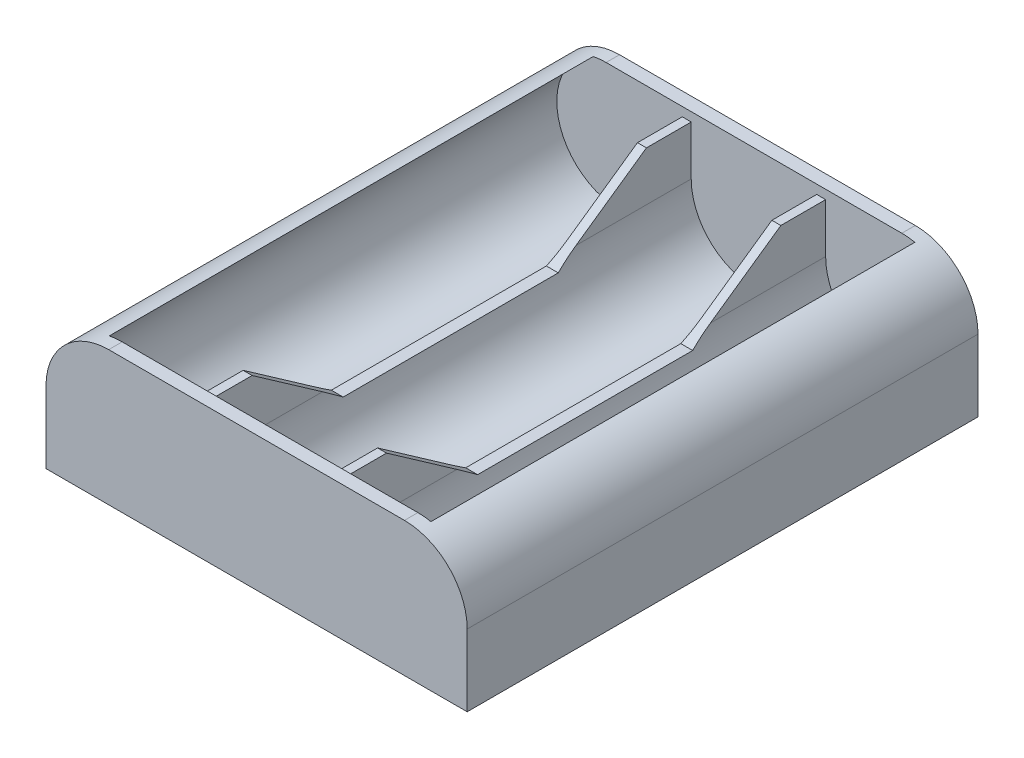
ISO-10303-21;
HEADER;
FILE_DESCRIPTION(('STEP AP214'),'2;1');
FILE_NAME('part.step','',(''),(''),'','','');
FILE_SCHEMA(('AUTOMOTIVE_DESIGN { 1 0 10303 214 1 1 1 1 }'));
ENDSEC;
DATA;
#1=APPLICATION_CONTEXT('core data for automotive mechanical design processes');
#2=APPLICATION_PROTOCOL_DEFINITION('international standard','automotive_design',2000,#1);
#3=PRODUCT_CONTEXT('',#1,'mechanical');
#4=PRODUCT('Part','Part','',(#3));
#5=PRODUCT_RELATED_PRODUCT_CATEGORY('part','',(#4));
#6=PRODUCT_DEFINITION_FORMATION('','',#4);
#7=PRODUCT_DEFINITION_CONTEXT('part definition',#1,'design');
#8=PRODUCT_DEFINITION('design','',#6,#7);
#9=PRODUCT_DEFINITION_SHAPE('','',#8);
#10=(LENGTH_UNIT() NAMED_UNIT(*) SI_UNIT(.MILLI.,.METRE.));
#11=(NAMED_UNIT(*) PLANE_ANGLE_UNIT() SI_UNIT($,.RADIAN.));
#12=(NAMED_UNIT(*) SI_UNIT($,.STERADIAN.) SOLID_ANGLE_UNIT());
#13=UNCERTAINTY_MEASURE_WITH_UNIT(LENGTH_MEASURE(1.E-05),#10,'distance_accuracy_value','');
#14=(GEOMETRIC_REPRESENTATION_CONTEXT(3) GLOBAL_UNCERTAINTY_ASSIGNED_CONTEXT((#13)) GLOBAL_UNIT_ASSIGNED_CONTEXT((#10,
#11,#12)) REPRESENTATION_CONTEXT('',''));
#15=CARTESIAN_POINT('',(0.,0.,0.));
#16=DIRECTION('',(0.,0.,1.));
#17=DIRECTION('',(1.,0.,0.));
#18=AXIS2_PLACEMENT_3D('',#15,#16,#17);
#19=CARTESIAN_POINT('',(8.50000000000001,8.5,1.49999999999999));
#20=DIRECTION('',(0.,0.,1.));
#21=DIRECTION('',(1.,0.,0.));
#22=AXIS2_PLACEMENT_3D('',#19,#20,#21);
#23=CYLINDRICAL_SURFACE('',#22,7.);
#24=CARTESIAN_POINT('',(8.50000000000001,8.5,14.3571428571428));
#25=DIRECTION('',(0.,0.81923192051904,0.573462344363328));
#26=DIRECTION('',(0.,-0.573462344363328,0.81923192051904));
#27=AXIS2_PLACEMENT_3D('',#24,#25,#26);
#28=ELLIPSE('',#27,12.2065556157337,7.);
#29=CARTESIAN_POINT('',(15.5,8.49999999999995,14.3571428571429));
#30=VERTEX_POINT('',#29);
#31=CARTESIAN_POINT('',(15.3373971655887,7.,16.5));
#32=VERTEX_POINT('',#31);
#33=EDGE_CURVE('E304',#30,#32,#28,.F.);
#34=ORIENTED_EDGE('',*,*,#33,.F.);
#35=DIRECTION('',(0.,0.,1.));
#36=VECTOR('',#35,1.);
#37=CARTESIAN_POINT('',(15.5,8.49999999999995,1.49999999999999));
#38=LINE('',#37,#36);
#39=CARTESIAN_POINT('',(15.5,8.49999999999995,1.49999999999999));
#40=VERTEX_POINT('',#39);
#41=EDGE_CURVE('E428',#40,#30,#38,.T.);
#42=ORIENTED_EDGE('',*,*,#41,.F.);
#43=CARTESIAN_POINT('',(8.50000000000001,8.5,1.49999999999999));
#44=DIRECTION('',(0.,0.,1.));
#45=DIRECTION('',(1.,0.,0.));
#46=AXIS2_PLACEMENT_3D('',#43,#44,#45);
#47=CIRCLE('',#46,7.);
#48=CARTESIAN_POINT('',(5.55056825520774,14.8482952343768,1.49999999999999));
#49=VERTEX_POINT('',#48);
#50=EDGE_CURVE('E460',#49,#40,#47,.T.);
#51=ORIENTED_EDGE('',*,*,#50,.F.);
#52=DIRECTION('',(0.,0.,1.));
#53=VECTOR('',#52,1.);
#54=CARTESIAN_POINT('',(5.55056825520774,14.8482952343768,1.49999999999999));
#55=LINE('',#54,#53);
#56=CARTESIAN_POINT('',(5.55056825520773,14.8482952343768,55.5));
#57=VERTEX_POINT('',#56);
#58=EDGE_CURVE('E521',#49,#57,#55,.T.);
#59=ORIENTED_EDGE('',*,*,#58,.T.);
#60=CARTESIAN_POINT('',(8.50000000000001,8.5,55.5));
#61=DIRECTION('',(0.,0.,1.));
#62=DIRECTION('',(1.,0.,0.));
#63=AXIS2_PLACEMENT_3D('',#60,#61,#62);
#64=CIRCLE('',#63,7.);
#65=CARTESIAN_POINT('',(15.5,8.49999999999995,55.5));
#66=VERTEX_POINT('',#65);
#67=EDGE_CURVE('E461',#57,#66,#64,.T.);
#68=ORIENTED_EDGE('',*,*,#67,.T.);
#69=CARTESIAN_POINT('',(15.5,8.49999999999996,42.6428571428571));
#70=VERTEX_POINT('',#69);
#71=EDGE_CURVE('E436',#70,#66,#38,.T.);
#72=ORIENTED_EDGE('',*,*,#71,.F.);
#73=CARTESIAN_POINT('',(8.50000000000001,8.5,42.6428571428571));
#74=DIRECTION('',(0.,0.81923192051904,-0.573462344363328));
#75=DIRECTION('',(0.,0.573462344363328,0.81923192051904));
#76=AXIS2_PLACEMENT_3D('',#73,#74,#75);
#77=ELLIPSE('',#76,12.2065556157337,7.);
#78=CARTESIAN_POINT('',(15.3373971655887,7.,40.5));
#79=VERTEX_POINT('',#78);
#80=EDGE_CURVE('E297',#79,#70,#77,.F.);
#81=ORIENTED_EDGE('',*,*,#80,.F.);
#82=DIRECTION('',(0.,0.,1.));
#83=VECTOR('',#82,1.);
#84=CARTESIAN_POINT('',(15.3373971655887,7.,1.49999999999999));
#85=LINE('',#84,#83);
#86=EDGE_CURVE('E300',#32,#79,#85,.T.);
#87=ORIENTED_EDGE('',*,*,#86,.F.);
#88=EDGE_LOOP('',(#34,#42,#51,#59,#68,#72,#81,#87));
#89=FACE_BOUND('',#88,.T.);
#90=ADVANCED_FACE('F39',(#89),#23,.F.);
#91=CARTESIAN_POINT('',(30.5,8.5,1.49999999999999));
#92=DIRECTION('',(1.,0.,0.));
#93=DIRECTION('',(0.,0.,-1.));
#94=AXIS2_PLACEMENT_3D('',#91,#92,#93);
#95=PLANE('',#94);
#96=DIRECTION('',(0.,0.,1.));
#97=VECTOR('',#96,1.);
#98=CARTESIAN_POINT('',(30.5,8.5,1.49999999999999));
#99=LINE('',#98,#97);
#100=CARTESIAN_POINT('',(30.5,8.5,1.49999999999999));
#101=VERTEX_POINT('',#100);
#102=CARTESIAN_POINT('',(30.5,8.5,14.3571428571428));
#103=VERTEX_POINT('',#102);
#104=EDGE_CURVE('E451',#101,#103,#99,.T.);
#105=ORIENTED_EDGE('',*,*,#104,.T.);
#106=DIRECTION('',(0.,0.573462344363328,-0.81923192051904));
#107=VECTOR('',#106,1.);
#108=CARTESIAN_POINT('',(30.5,14.5402684563758,5.72818791946308));
#109=LINE('',#108,#107);
#110=CARTESIAN_POINT('',(30.5,14.,6.49999999999999));
#111=VERTEX_POINT('',#110);
#112=EDGE_CURVE('E356',#103,#111,#109,.T.);
#113=ORIENTED_EDGE('',*,*,#112,.T.);
#114=DIRECTION('',(0.,0.,1.));
#115=VECTOR('',#114,1.);
#116=CARTESIAN_POINT('',(30.5,14.,1.49999999999999));
#117=LINE('',#116,#115);
#118=CARTESIAN_POINT('',(30.5,14.,1.49999999999999));
#119=VERTEX_POINT('',#118);
#120=EDGE_CURVE('E381',#119,#111,#117,.T.);
#121=ORIENTED_EDGE('',*,*,#120,.F.);
#122=DIRECTION('',(0.,1.,0.));
#123=VECTOR('',#122,1.);
#124=CARTESIAN_POINT('',(30.5,8.5,1.49999999999999));
#125=LINE('',#124,#123);
#126=EDGE_CURVE('E443',#101,#119,#125,.T.);
#127=ORIENTED_EDGE('',*,*,#126,.F.);
#128=EDGE_LOOP('',(#105,#113,#121,#127));
#129=FACE_BOUND('',#128,.T.);
#130=ADVANCED_FACE('F629',(#129),#95,.F.);
#131=CARTESIAN_POINT('',(31.5,8.49999999999995,1.49999999999999));
#132=DIRECTION('',(-1.,0.,0.));
#133=DIRECTION('',(0.,0.,1.));
#134=AXIS2_PLACEMENT_3D('',#131,#132,#133);
#135=PLANE('',#134);
#136=DIRECTION('',(0.,0.,1.));
#137=VECTOR('',#136,1.);
#138=CARTESIAN_POINT('',(31.5,14.,1.49999999999999));
#139=LINE('',#138,#137);
#140=CARTESIAN_POINT('',(31.5,14.,1.49999999999999));
#141=VERTEX_POINT('',#140);
#142=CARTESIAN_POINT('',(31.5,14.,6.49999999999999));
#143=VERTEX_POINT('',#142);
#144=EDGE_CURVE('E402',#141,#143,#139,.T.);
#145=ORIENTED_EDGE('',*,*,#144,.T.);
#146=DIRECTION('',(0.,-0.573462344363328,0.81923192051904));
#147=VECTOR('',#146,1.);
#148=CARTESIAN_POINT('',(31.5,14.5402684563758,5.7281879194631));
#149=LINE('',#148,#147);
#150=CARTESIAN_POINT('',(31.5,8.49999999999995,14.3571428571429));
#151=VERTEX_POINT('',#150);
#152=EDGE_CURVE('E364',#143,#151,#149,.T.);
#153=ORIENTED_EDGE('',*,*,#152,.T.);
#154=DIRECTION('',(0.,0.,1.));
#155=VECTOR('',#154,1.);
#156=CARTESIAN_POINT('',(31.5,8.49999999999995,1.49999999999999));
#157=LINE('',#156,#155);
#158=CARTESIAN_POINT('',(31.5,8.5,1.49999999999999));
#159=VERTEX_POINT('',#158);
#160=EDGE_CURVE('E415',#159,#151,#157,.T.);
#161=ORIENTED_EDGE('',*,*,#160,.F.);
#162=DIRECTION('',(0.,-1.,0.));
#163=VECTOR('',#162,1.);
#164=CARTESIAN_POINT('',(31.5,8.49999999999995,1.49999999999999));
#165=LINE('',#164,#163);
#166=EDGE_CURVE('E406',#141,#159,#165,.T.);
#167=ORIENTED_EDGE('',*,*,#166,.F.);
#168=EDGE_LOOP('',(#145,#153,#161,#167));
#169=FACE_BOUND('',#168,.T.);
#170=ADVANCED_FACE('F621',(#169),#135,.F.);
#171=CARTESIAN_POINT('',(15.5,8.49999999999995,1.49999999999999));
#172=DIRECTION('',(1.,0.,0.));
#173=DIRECTION('',(0.,0.,-1.));
#174=AXIS2_PLACEMENT_3D('',#171,#172,#173);
#175=PLANE('',#174);
#176=ORIENTED_EDGE('',*,*,#41,.T.);
#177=DIRECTION('',(0.,-0.573462344363328,0.81923192051904));
#178=VECTOR('',#177,1.);
#179=CARTESIAN_POINT('',(15.5,14.,6.49999999999999));
#180=LINE('',#179,#178);
#181=CARTESIAN_POINT('',(15.5,14.,6.49999999999999));
#182=VERTEX_POINT('',#181);
#183=EDGE_CURVE('E308',#182,#30,#180,.T.);
#184=ORIENTED_EDGE('',*,*,#183,.F.);
#185=DIRECTION('',(0.,0.,1.));
#186=VECTOR('',#185,1.);
#187=CARTESIAN_POINT('',(15.5,14.,1.49999999999999));
#188=LINE('',#187,#186);
#189=CARTESIAN_POINT('',(15.5,14.,1.49999999999999));
#190=VERTEX_POINT('',#189);
#191=EDGE_CURVE('E388',#190,#182,#188,.T.);
#192=ORIENTED_EDGE('',*,*,#191,.F.);
#193=DIRECTION('',(0.,1.,0.));
#194=VECTOR('',#193,1.);
#195=CARTESIAN_POINT('',(15.5,8.49999999999995,1.49999999999999));
#196=LINE('',#195,#194);
#197=EDGE_CURVE('E432',#40,#190,#196,.T.);
#198=ORIENTED_EDGE('',*,*,#197,.F.);
#199=EDGE_LOOP('',(#176,#184,#192,#198));
#200=FACE_BOUND('',#199,.T.);
#201=ADVANCED_FACE('F640',(#200),#175,.F.);
#202=CARTESIAN_POINT('',(16.5,8.5,1.49999999999999));
#203=DIRECTION('',(-1.,0.,0.));
#204=DIRECTION('',(0.,0.,1.));
#205=AXIS2_PLACEMENT_3D('',#202,#203,#204);
#206=PLANE('',#205);
#207=DIRECTION('',(0.,0.,1.));
#208=VECTOR('',#207,1.);
#209=CARTESIAN_POINT('',(16.5,14.,1.49999999999999));
#210=LINE('',#209,#208);
#211=CARTESIAN_POINT('',(16.5,14.,1.49999999999999));
#212=VERTEX_POINT('',#211);
#213=CARTESIAN_POINT('',(16.5,14.,6.49999999999999));
#214=VERTEX_POINT('',#213);
#215=EDGE_CURVE('E382',#212,#214,#210,.T.);
#216=ORIENTED_EDGE('',*,*,#215,.T.);
#217=DIRECTION('',(0.,-0.573462344363328,0.81923192051904));
#218=VECTOR('',#217,1.);
#219=CARTESIAN_POINT('',(16.5,14.5402684563758,5.72818791946308));
#220=LINE('',#219,#218);
#221=CARTESIAN_POINT('',(16.5,8.5,14.3571428571428));
#222=VERTEX_POINT('',#221);
#223=EDGE_CURVE('E347',#214,#222,#220,.T.);
#224=ORIENTED_EDGE('',*,*,#223,.T.);
#225=DIRECTION('',(0.,0.,1.));
#226=VECTOR('',#225,1.);
#227=CARTESIAN_POINT('',(16.5,8.5,1.49999999999999));
#228=LINE('',#227,#226);
#229=CARTESIAN_POINT('',(16.5,8.5,1.49999999999999));
#230=VERTEX_POINT('',#229);
#231=EDGE_CURVE('E414',#230,#222,#228,.T.);
#232=ORIENTED_EDGE('',*,*,#231,.F.);
#233=DIRECTION('',(0.,-1.,0.));
#234=VECTOR('',#233,1.);
#235=CARTESIAN_POINT('',(16.5,8.5,1.49999999999999));
#236=LINE('',#235,#234);
#237=EDGE_CURVE('E420',#212,#230,#236,.T.);
#238=ORIENTED_EDGE('',*,*,#237,.F.);
#239=EDGE_LOOP('',(#216,#224,#232,#238));
#240=FACE_BOUND('',#239,.T.);
#241=ADVANCED_FACE('F634',(#240),#206,.F.);
#242=CARTESIAN_POINT('',(0.,14.,1.49999999999999));
#243=DIRECTION('',(0.,1.,0.));
#244=DIRECTION('',(0.,0.,1.));
#245=AXIS2_PLACEMENT_3D('',#242,#243,#244);
#246=PLANE('',#245);
#247=DIRECTION('',(-1.,0.,0.));
#248=VECTOR('',#247,1.);
#249=CARTESIAN_POINT('',(35.5,14.,6.49999999999999));
#250=LINE('',#249,#248);
#251=EDGE_CURVE('E315',#143,#111,#250,.T.);
#252=ORIENTED_EDGE('',*,*,#251,.F.);
#253=ORIENTED_EDGE('',*,*,#144,.F.);
#254=DIRECTION('',(-1.,0.,0.));
#255=VECTOR('',#254,1.);
#256=CARTESIAN_POINT('',(0.,14.,1.49999999999999));
#257=LINE('',#256,#255);
#258=EDGE_CURVE('E392',#141,#119,#257,.T.);
#259=ORIENTED_EDGE('',*,*,#258,.T.);
#260=ORIENTED_EDGE('',*,*,#120,.T.);
#261=EDGE_LOOP('',(#252,#253,#259,#260));
#262=FACE_BOUND('',#261,.T.);
#263=ADVANCED_FACE('F626',(#262),#246,.T.);
#264=CARTESIAN_POINT('',(0.,14.,1.49999999999999));
#265=DIRECTION('',(0.,-1.,0.));
#266=DIRECTION('',(0.,0.,-1.));
#267=AXIS2_PLACEMENT_3D('',#264,#265,#266);
#268=PLANE('',#267);
#269=ORIENTED_EDGE('',*,*,#191,.T.);
#270=DIRECTION('',(1.,0.,0.));
#271=VECTOR('',#270,1.);
#272=CARTESIAN_POINT('',(0.,14.,6.49999999999999));
#273=LINE('',#272,#271);
#274=EDGE_CURVE('E534',#182,#214,#273,.T.);
#275=ORIENTED_EDGE('',*,*,#274,.T.);
#276=ORIENTED_EDGE('',*,*,#215,.F.);
#277=DIRECTION('',(1.,0.,0.));
#278=VECTOR('',#277,1.);
#279=CARTESIAN_POINT('',(0.,14.,1.49999999999999));
#280=LINE('',#279,#278);
#281=EDGE_CURVE('E373',#190,#212,#280,.T.);
#282=ORIENTED_EDGE('',*,*,#281,.F.);
#283=EDGE_LOOP('',(#269,#275,#276,#282));
#284=FACE_BOUND('',#283,.T.);
#285=ADVANCED_FACE('F637',(#284),#268,.F.);
#286=CARTESIAN_POINT('',(0.,15.,0.));
#287=DIRECTION('',(0.,1.,0.));
#288=DIRECTION('',(0.,0.,1.));
#289=AXIS2_PLACEMENT_3D('',#286,#287,#288);
#290=PLANE('',#289);
#291=DIRECTION('',(-1.,0.,0.));
#292=VECTOR('',#291,1.);
#293=CARTESIAN_POINT('',(0.,15.,1.49999999999999));
#294=LINE('',#293,#292);
#295=CARTESIAN_POINT('',(40.,15.,1.49999999999999));
#296=VERTEX_POINT('',#295);
#297=CARTESIAN_POINT('',(7.,15.,1.49999999999999));
#298=VERTEX_POINT('',#297);
#299=EDGE_CURVE('E456',#296,#298,#294,.T.);
#300=ORIENTED_EDGE('',*,*,#299,.F.);
#301=DIRECTION('',(0.,0.,-1.));
#302=VECTOR('',#301,1.);
#303=CARTESIAN_POINT('',(40.,15.,0.));
#304=LINE('',#303,#302);
#305=CARTESIAN_POINT('',(40.,15.,0.));
#306=VERTEX_POINT('',#305);
#307=EDGE_CURVE('E495',#296,#306,#304,.T.);
#308=ORIENTED_EDGE('',*,*,#307,.T.);
#309=DIRECTION('',(-1.,0.,0.));
#310=VECTOR('',#309,1.);
#311=CARTESIAN_POINT('',(47.,15.,0.));
#312=LINE('',#311,#310);
#313=CARTESIAN_POINT('',(7.,15.,0.));
#314=VERTEX_POINT('',#313);
#315=EDGE_CURVE('E482',#306,#314,#312,.T.);
#316=ORIENTED_EDGE('',*,*,#315,.T.);
#317=DIRECTION('',(0.,0.,1.));
#318=VECTOR('',#317,1.);
#319=CARTESIAN_POINT('',(7.,15.,0.));
#320=LINE('',#319,#318);
#321=EDGE_CURVE('E513',#314,#298,#320,.T.);
#322=ORIENTED_EDGE('',*,*,#321,.T.);
#323=EDGE_LOOP('',(#300,#308,#316,#322));
#324=FACE_BOUND('',#323,.T.);
#325=ADVANCED_FACE('F658',(#324),#290,.T.);
#326=CARTESIAN_POINT('',(30.5,14.,50.5));
#327=VERTEX_POINT('',#326);
#328=CARTESIAN_POINT('',(30.5,14.,55.5));
#329=VERTEX_POINT('',#328);
#330=EDGE_CURVE('E401',#327,#329,#117,.T.);
#331=ORIENTED_EDGE('',*,*,#330,.F.);
#332=DIRECTION('',(0.,-0.573462344363328,-0.81923192051904));
#333=VECTOR('',#332,1.);
#334=CARTESIAN_POINT('',(30.5,-10.8288590604027,15.0302013422819));
#335=LINE('',#334,#333);
#336=CARTESIAN_POINT('',(30.5,8.5,42.6428571428571));
#337=VERTEX_POINT('',#336);
#338=EDGE_CURVE('E55',#327,#337,#335,.T.);
#339=ORIENTED_EDGE('',*,*,#338,.T.);
#340=CARTESIAN_POINT('',(30.5,8.5,55.5));
#341=VERTEX_POINT('',#340);
#342=EDGE_CURVE('E447',#337,#341,#99,.T.);
#343=ORIENTED_EDGE('',*,*,#342,.T.);
#344=DIRECTION('',(0.,1.,0.));
#345=VECTOR('',#344,1.);
#346=CARTESIAN_POINT('',(30.5,8.5,55.5));
#347=LINE('',#346,#345);
#348=EDGE_CURVE('E419',#341,#329,#347,.T.);
#349=ORIENTED_EDGE('',*,*,#348,.T.);
#350=EDGE_LOOP('',(#331,#339,#343,#349));
#351=FACE_BOUND('',#350,.T.);
#352=ADVANCED_FACE('F587',(#351),#95,.F.);
#353=CARTESIAN_POINT('',(31.5,8.49999999999995,42.6428571428571));
#354=VERTEX_POINT('',#353);
#355=CARTESIAN_POINT('',(31.5,8.49999999999995,55.5));
#356=VERTEX_POINT('',#355);
#357=EDGE_CURVE('E409',#354,#356,#157,.T.);
#358=ORIENTED_EDGE('',*,*,#357,.F.);
#359=DIRECTION('',(0.,0.573462344363328,0.81923192051904));
#360=VECTOR('',#359,1.);
#361=CARTESIAN_POINT('',(31.5,-10.8288590604027,15.0302013422819));
#362=LINE('',#361,#360);
#363=CARTESIAN_POINT('',(31.5,14.,50.5));
#364=VERTEX_POINT('',#363);
#365=EDGE_CURVE('E343',#354,#364,#362,.T.);
#366=ORIENTED_EDGE('',*,*,#365,.T.);
#367=CARTESIAN_POINT('',(31.5,14.,55.5));
#368=VERTEX_POINT('',#367);
#369=EDGE_CURVE('E395',#364,#368,#139,.T.);
#370=ORIENTED_EDGE('',*,*,#369,.T.);
#371=DIRECTION('',(0.,-1.,0.));
#372=VECTOR('',#371,1.);
#373=CARTESIAN_POINT('',(31.5,8.49999999999995,55.5));
#374=LINE('',#373,#372);
#375=EDGE_CURVE('E410',#368,#356,#374,.T.);
#376=ORIENTED_EDGE('',*,*,#375,.T.);
#377=EDGE_LOOP('',(#358,#366,#370,#376));
#378=FACE_BOUND('',#377,.T.);
#379=ADVANCED_FACE('F594',(#378),#135,.F.);
#380=CARTESIAN_POINT('',(38.5,8.5,1.49999999999999));
#381=DIRECTION('',(0.,0.,1.));
#382=DIRECTION('',(1.,0.,0.));
#383=AXIS2_PLACEMENT_3D('',#380,#381,#382);
#384=CYLINDRICAL_SURFACE('',#383,7.);
#385=ORIENTED_EDGE('',*,*,#160,.T.);
#386=CARTESIAN_POINT('',(38.5,8.5,14.3571428571428));
#387=DIRECTION('',(0.,-0.81923192051904,-0.573462344363328));
#388=DIRECTION('',(0.,-0.573462344363328,0.81923192051904));
#389=AXIS2_PLACEMENT_3D('',#386,#387,#388);
#390=ELLIPSE('',#389,12.2065556157337,7.);
#391=CARTESIAN_POINT('',(31.6626028344113,7.,16.5));
#392=VERTEX_POINT('',#391);
#393=EDGE_CURVE('E360',#151,#392,#390,.F.);
#394=ORIENTED_EDGE('',*,*,#393,.T.);
#395=DIRECTION('',(0.,0.,1.));
#396=VECTOR('',#395,1.);
#397=CARTESIAN_POINT('',(31.6626028344113,7.,1.49999999999999));
#398=LINE('',#397,#396);
#399=CARTESIAN_POINT('',(31.6626028344113,7.,40.5));
#400=VERTEX_POINT('',#399);
#401=EDGE_CURVE('E368',#392,#400,#398,.T.);
#402=ORIENTED_EDGE('',*,*,#401,.T.);
#403=CARTESIAN_POINT('',(38.5,8.5,42.6428571428571));
#404=DIRECTION('',(0.,-0.81923192051904,0.573462344363328));
#405=DIRECTION('',(0.,0.573462344363328,0.81923192051904));
#406=AXIS2_PLACEMENT_3D('',#403,#404,#405);
#407=ELLIPSE('',#406,12.2065556157337,7.);
#408=EDGE_CURVE('E339',#400,#354,#407,.F.);
#409=ORIENTED_EDGE('',*,*,#408,.T.);
#410=ORIENTED_EDGE('',*,*,#357,.T.);
#411=CARTESIAN_POINT('',(38.5,8.5,55.5));
#412=DIRECTION('',(0.,0.,1.));
#413=DIRECTION('',(1.,0.,0.));
#414=AXIS2_PLACEMENT_3D('',#411,#412,#413);
#415=CIRCLE('',#414,7.);
#416=CARTESIAN_POINT('',(41.4494317447923,14.8482952343768,55.5));
#417=VERTEX_POINT('',#416);
#418=EDGE_CURVE('E455',#356,#417,#415,.T.);
#419=ORIENTED_EDGE('',*,*,#418,.T.);
#420=DIRECTION('',(0.,0.,-1.));
#421=VECTOR('',#420,1.);
#422=CARTESIAN_POINT('',(41.4494317447923,14.8482952343768,1.49999999999999));
#423=LINE('',#422,#421);
#424=CARTESIAN_POINT('',(41.4494317447923,14.8482952343768,1.49999999999999));
#425=VERTEX_POINT('',#424);
#426=EDGE_CURVE('E502',#417,#425,#423,.T.);
#427=ORIENTED_EDGE('',*,*,#426,.T.);
#428=CARTESIAN_POINT('',(38.5,8.5,1.49999999999999));
#429=DIRECTION('',(0.,0.,1.));
#430=DIRECTION('',(1.,0.,0.));
#431=AXIS2_PLACEMENT_3D('',#428,#429,#430);
#432=CIRCLE('',#431,7.);
#433=EDGE_CURVE('E476',#159,#425,#432,.T.);
#434=ORIENTED_EDGE('',*,*,#433,.F.);
#435=EDGE_LOOP('',(#385,#394,#402,#409,#410,#419,#427,#434));
#436=FACE_BOUND('',#435,.T.);
#437=ADVANCED_FACE('F609',(#436),#384,.F.);
#438=CARTESIAN_POINT('',(23.5,8.5,1.49999999999999));
#439=DIRECTION('',(0.,0.,1.));
#440=DIRECTION('',(1.,0.,0.));
#441=AXIS2_PLACEMENT_3D('',#438,#439,#440);
#442=CYLINDRICAL_SURFACE('',#441,7.);
#443=DIRECTION('',(0.,0.,1.));
#444=VECTOR('',#443,1.);
#445=CARTESIAN_POINT('',(30.3373971655887,7.,1.49999999999999));
#446=LINE('',#445,#444);
#447=CARTESIAN_POINT('',(30.3373971655887,7.,40.5));
#448=VERTEX_POINT('',#447);
#449=CARTESIAN_POINT('',(30.3373971655887,7.,16.5));
#450=VERTEX_POINT('',#449);
#451=EDGE_CURVE('E11',#448,#450,#446,.F.);
#452=ORIENTED_EDGE('',*,*,#451,.T.);
#453=CARTESIAN_POINT('',(23.5,8.5,14.3571428571428));
#454=DIRECTION('',(0.,-0.81923192051904,-0.573462344363328));
#455=DIRECTION('',(0.,-0.573462344363328,0.81923192051904));
#456=AXIS2_PLACEMENT_3D('',#453,#454,#455);
#457=ELLIPSE('',#456,12.2065556157337,7.);
#458=EDGE_CURVE('E355',#450,#103,#457,.F.);
#459=ORIENTED_EDGE('',*,*,#458,.T.);
#460=ORIENTED_EDGE('',*,*,#104,.F.);
#461=CARTESIAN_POINT('',(23.5,8.5,1.49999999999999));
#462=DIRECTION('',(0.,0.,1.));
#463=DIRECTION('',(1.,0.,0.));
#464=AXIS2_PLACEMENT_3D('',#461,#462,#463);
#465=CIRCLE('',#464,7.);
#466=EDGE_CURVE('E468',#230,#101,#465,.T.);
#467=ORIENTED_EDGE('',*,*,#466,.F.);
#468=ORIENTED_EDGE('',*,*,#231,.T.);
#469=CARTESIAN_POINT('',(16.6626028344113,7.,16.5));
#470=VERTEX_POINT('',#469);
#471=EDGE_CURVE('E351',#222,#470,#457,.F.);
#472=ORIENTED_EDGE('',*,*,#471,.T.);
#473=DIRECTION('',(0.,0.,1.));
#474=VECTOR('',#473,1.);
#475=CARTESIAN_POINT('',(16.6626028344113,7.,1.49999999999999));
#476=LINE('',#475,#474);
#477=CARTESIAN_POINT('',(16.6626028344113,7.,40.5));
#478=VERTEX_POINT('',#477);
#479=EDGE_CURVE('E48',#470,#478,#476,.T.);
#480=ORIENTED_EDGE('',*,*,#479,.T.);
#481=CARTESIAN_POINT('',(23.5,8.5,42.6428571428571));
#482=DIRECTION('',(0.,-0.81923192051904,0.573462344363328));
#483=DIRECTION('',(0.,0.573462344363328,0.81923192051904));
#484=AXIS2_PLACEMENT_3D('',#481,#482,#483);
#485=ELLIPSE('',#484,12.2065556157337,7.);
#486=CARTESIAN_POINT('',(16.5,8.5,42.6428571428571));
#487=VERTEX_POINT('',#486);
#488=EDGE_CURVE('E332',#478,#487,#485,.F.);
#489=ORIENTED_EDGE('',*,*,#488,.T.);
#490=CARTESIAN_POINT('',(16.5,8.5,55.5));
#491=VERTEX_POINT('',#490);
#492=EDGE_CURVE('E423',#487,#491,#228,.T.);
#493=ORIENTED_EDGE('',*,*,#492,.T.);
#494=CARTESIAN_POINT('',(23.5,8.5,55.5));
#495=DIRECTION('',(0.,0.,1.));
#496=DIRECTION('',(1.,0.,0.));
#497=AXIS2_PLACEMENT_3D('',#494,#495,#496);
#498=CIRCLE('',#497,7.);
#499=EDGE_CURVE('E472',#491,#341,#498,.T.);
#500=ORIENTED_EDGE('',*,*,#499,.T.);
#501=ORIENTED_EDGE('',*,*,#342,.F.);
#502=EDGE_CURVE('E336',#337,#448,#485,.F.);
#503=ORIENTED_EDGE('',*,*,#502,.T.);
#504=EDGE_LOOP('',(#452,#459,#460,#467,#468,#472,#480,#489,#493,#500,#501,#503));
#505=FACE_BOUND('',#504,.T.);
#506=ADVANCED_FACE('F540',(#505),#442,.F.);
#507=CARTESIAN_POINT('',(7.,8.,0.));
#508=DIRECTION('',(0.,0.,-1.));
#509=DIRECTION('',(-1.,0.,0.));
#510=AXIS2_PLACEMENT_3D('',#507,#508,#509);
#511=CYLINDRICAL_SURFACE('',#510,7.);
#512=ORIENTED_EDGE('',*,*,#321,.F.);
#513=CARTESIAN_POINT('',(7.,8.,0.));
#514=DIRECTION('',(0.,0.,1.));
#515=DIRECTION('',(1.,0.,0.));
#516=AXIS2_PLACEMENT_3D('',#513,#514,#515);
#517=CIRCLE('',#516,7.);
#518=CARTESIAN_POINT('',(0.,8.,0.));
#519=VERTEX_POINT('',#518);
#520=EDGE_CURVE('E528',#519,#314,#517,.F.);
#521=ORIENTED_EDGE('',*,*,#520,.F.);
#522=DIRECTION('',(0.,0.,1.));
#523=VECTOR('',#522,1.);
#524=CARTESIAN_POINT('',(0.,8.,0.));
#525=LINE('',#524,#523);
#526=CARTESIAN_POINT('',(0.,8.,57.));
#527=VERTEX_POINT('',#526);
#528=EDGE_CURVE('E525',#527,#519,#525,.F.);
#529=ORIENTED_EDGE('',*,*,#528,.F.);
#530=CARTESIAN_POINT('',(7.,8.,57.));
#531=DIRECTION('',(0.,0.,1.));
#532=DIRECTION('',(1.,0.,0.));
#533=AXIS2_PLACEMENT_3D('',#530,#531,#532);
#534=CIRCLE('',#533,7.);
#535=CARTESIAN_POINT('',(7.,15.,57.));
#536=VERTEX_POINT('',#535);
#537=EDGE_CURVE('E265',#536,#527,#534,.T.);
#538=ORIENTED_EDGE('',*,*,#537,.F.);
#539=DIRECTION('',(0.,0.,-1.));
#540=VECTOR('',#539,1.);
#541=CARTESIAN_POINT('',(7.,15.,57.));
#542=LINE('',#541,#540);
#543=CARTESIAN_POINT('',(7.,15.,55.5));
#544=VERTEX_POINT('',#543);
#545=EDGE_CURVE('E284',#536,#544,#542,.T.);
#546=ORIENTED_EDGE('',*,*,#545,.T.);
#547=CARTESIAN_POINT('',(7.,8.,55.5));
#548=DIRECTION('',(0.,0.,1.));
#549=DIRECTION('',(1.,0.,0.));
#550=AXIS2_PLACEMENT_3D('',#547,#548,#549);
#551=CIRCLE('',#550,7.);
#552=EDGE_CURVE('E267',#544,#57,#551,.T.);
#553=ORIENTED_EDGE('',*,*,#552,.T.);
#554=ORIENTED_EDGE('',*,*,#58,.F.);
#555=CARTESIAN_POINT('',(7.,8.,1.49999999999999));
#556=DIRECTION('',(0.,0.,1.));
#557=DIRECTION('',(1.,0.,0.));
#558=AXIS2_PLACEMENT_3D('',#555,#556,#557);
#559=CIRCLE('',#558,7.);
#560=EDGE_CURVE('E517',#298,#49,#559,.T.);
#561=ORIENTED_EDGE('',*,*,#560,.F.);
#562=EDGE_LOOP('',(#512,#521,#529,#538,#546,#553,#554,#561));
#563=FACE_BOUND('',#562,.T.);
#564=ADVANCED_FACE('F41',(#563),#511,.T.);
#565=CARTESIAN_POINT('',(40.,8.,0.));
#566=DIRECTION('',(0.,0.,1.));
#567=DIRECTION('',(1.,0.,0.));
#568=AXIS2_PLACEMENT_3D('',#565,#566,#567);
#569=CYLINDRICAL_SURFACE('',#568,7.);
#570=ORIENTED_EDGE('',*,*,#307,.F.);
#571=CARTESIAN_POINT('',(40.,8.,1.49999999999999));
#572=DIRECTION('',(0.,0.,1.));
#573=DIRECTION('',(1.,0.,0.));
#574=AXIS2_PLACEMENT_3D('',#571,#572,#573);
#575=CIRCLE('',#574,7.);
#576=EDGE_CURVE('E506',#425,#296,#575,.T.);
#577=ORIENTED_EDGE('',*,*,#576,.F.);
#578=ORIENTED_EDGE('',*,*,#426,.F.);
#579=CARTESIAN_POINT('',(40.,8.,55.5));
#580=DIRECTION('',(0.,0.,1.));
#581=DIRECTION('',(1.,0.,0.));
#582=AXIS2_PLACEMENT_3D('',#579,#580,#581);
#583=CIRCLE('',#582,7.);
#584=CARTESIAN_POINT('',(40.,15.,55.5));
#585=VERTEX_POINT('',#584);
#586=EDGE_CURVE('E285',#417,#585,#583,.T.);
#587=ORIENTED_EDGE('',*,*,#586,.T.);
#588=DIRECTION('',(0.,0.,-1.));
#589=VECTOR('',#588,1.);
#590=CARTESIAN_POINT('',(40.,15.,57.));
#591=LINE('',#590,#589);
#592=CARTESIAN_POINT('',(40.,15.,57.));
#593=VERTEX_POINT('',#592);
#594=EDGE_CURVE('E293',#593,#585,#591,.T.);
#595=ORIENTED_EDGE('',*,*,#594,.F.);
#596=CARTESIAN_POINT('',(40.,8.,57.));
#597=DIRECTION('',(0.,0.,1.));
#598=DIRECTION('',(1.,0.,0.));
#599=AXIS2_PLACEMENT_3D('',#596,#597,#598);
#600=CIRCLE('',#599,7.);
#601=CARTESIAN_POINT('',(47.,8.,57.));
#602=VERTEX_POINT('',#601);
#603=EDGE_CURVE('E276',#602,#593,#600,.T.);
#604=ORIENTED_EDGE('',*,*,#603,.F.);
#605=DIRECTION('',(0.,0.,-1.));
#606=VECTOR('',#605,1.);
#607=CARTESIAN_POINT('',(47.,8.,0.));
#608=LINE('',#607,#606);
#609=CARTESIAN_POINT('',(47.,8.,0.));
#610=VERTEX_POINT('',#609);
#611=EDGE_CURVE('E499',#610,#602,#608,.F.);
#612=ORIENTED_EDGE('',*,*,#611,.F.);
#613=CARTESIAN_POINT('',(40.,8.,0.));
#614=DIRECTION('',(0.,0.,1.));
#615=DIRECTION('',(1.,0.,0.));
#616=AXIS2_PLACEMENT_3D('',#613,#614,#615);
#617=CIRCLE('',#616,7.);
#618=EDGE_CURVE('E510',#306,#610,#617,.F.);
#619=ORIENTED_EDGE('',*,*,#618,.F.);
#620=EDGE_LOOP('',(#570,#577,#578,#587,#595,#604,#612,#619));
#621=FACE_BOUND('',#620,.T.);
#622=ADVANCED_FACE('F614',(#621),#569,.T.);
#623=CARTESIAN_POINT('',(47.,15.,0.));
#624=DIRECTION('',(0.,0.,1.));
#625=DIRECTION('',(1.,0.,0.));
#626=AXIS2_PLACEMENT_3D('',#623,#624,#625);
#627=PLANE('',#626);
#628=DIRECTION('',(0.,-1.,0.));
#629=VECTOR('',#628,1.);
#630=CARTESIAN_POINT('',(0.,15.,0.));
#631=LINE('',#630,#629);
#632=CARTESIAN_POINT('',(0.,0.,0.));
#633=VERTEX_POINT('',#632);
#634=EDGE_CURVE('E244',#519,#633,#631,.T.);
#635=ORIENTED_EDGE('',*,*,#634,.F.);
#636=ORIENTED_EDGE('',*,*,#520,.T.);
#637=ORIENTED_EDGE('',*,*,#315,.F.);
#638=ORIENTED_EDGE('',*,*,#618,.T.);
#639=DIRECTION('',(0.,-1.,0.));
#640=VECTOR('',#639,1.);
#641=CARTESIAN_POINT('',(47.,15.,0.));
#642=LINE('',#641,#640);
#643=CARTESIAN_POINT('',(47.,0.,0.));
#644=VERTEX_POINT('',#643);
#645=EDGE_CURVE('E486',#610,#644,#642,.T.);
#646=ORIENTED_EDGE('',*,*,#645,.T.);
#647=DIRECTION('',(-1.,0.,0.));
#648=VECTOR('',#647,1.);
#649=CARTESIAN_POINT('',(47.,0.,0.));
#650=LINE('',#649,#648);
#651=EDGE_CURVE('E250',#644,#633,#650,.T.);
#652=ORIENTED_EDGE('',*,*,#651,.T.);
#653=EDGE_LOOP('',(#635,#636,#637,#638,#646,#652));
#654=FACE_BOUND('',#653,.T.);
#655=ADVANCED_FACE('F655',(#654),#627,.F.);
#656=CARTESIAN_POINT('',(0.,15.,0.));
#657=DIRECTION('',(1.,0.,0.));
#658=DIRECTION('',(0.,0.,-1.));
#659=AXIS2_PLACEMENT_3D('',#656,#657,#658);
#660=PLANE('',#659);
#661=DIRECTION('',(0.,0.,1.));
#662=VECTOR('',#661,1.);
#663=CARTESIAN_POINT('',(0.,0.,0.));
#664=LINE('',#663,#662);
#665=CARTESIAN_POINT('',(0.,0.,57.));
#666=VERTEX_POINT('',#665);
#667=EDGE_CURVE('E237',#633,#666,#664,.T.);
#668=ORIENTED_EDGE('',*,*,#667,.T.);
#669=DIRECTION('',(0.,-1.,0.));
#670=VECTOR('',#669,1.);
#671=CARTESIAN_POINT('',(0.,8.,57.));
#672=LINE('',#671,#670);
#673=EDGE_CURVE('E242',#527,#666,#672,.T.);
#674=ORIENTED_EDGE('',*,*,#673,.F.);
#675=ORIENTED_EDGE('',*,*,#528,.T.);
#676=ORIENTED_EDGE('',*,*,#634,.T.);
#677=EDGE_LOOP('',(#668,#674,#675,#676));
#678=FACE_BOUND('',#677,.T.);
#679=ADVANCED_FACE('F239',(#678),#660,.F.);
#680=CARTESIAN_POINT('',(47.,15.,55.5));
#681=DIRECTION('',(-1.,0.,0.));
#682=DIRECTION('',(0.,0.,1.));
#683=AXIS2_PLACEMENT_3D('',#680,#681,#682);
#684=PLANE('',#683);
#685=ORIENTED_EDGE('',*,*,#645,.F.);
#686=ORIENTED_EDGE('',*,*,#611,.T.);
#687=DIRECTION('',(0.,1.,0.));
#688=VECTOR('',#687,1.);
#689=CARTESIAN_POINT('',(47.,0.,57.));
#690=LINE('',#689,#688);
#691=CARTESIAN_POINT('',(47.,0.,57.));
#692=VERTEX_POINT('',#691);
#693=EDGE_CURVE('E260',#692,#602,#690,.T.);
#694=ORIENTED_EDGE('',*,*,#693,.F.);
#695=DIRECTION('',(0.,0.,-1.));
#696=VECTOR('',#695,1.);
#697=CARTESIAN_POINT('',(47.,0.,55.5));
#698=LINE('',#697,#696);
#699=EDGE_CURVE('E249',#692,#644,#698,.T.);
#700=ORIENTED_EDGE('',*,*,#699,.T.);
#701=EDGE_LOOP('',(#685,#686,#694,#700));
#702=FACE_BOUND('',#701,.T.);
#703=ADVANCED_FACE('F653',(#702),#684,.F.);
#704=CARTESIAN_POINT('',(0.,0.,0.));
#705=DIRECTION('',(0.,1.,0.));
#706=DIRECTION('',(0.,0.,1.));
#707=AXIS2_PLACEMENT_3D('',#704,#705,#706);
#708=PLANE('',#707);
#709=ORIENTED_EDGE('',*,*,#651,.F.);
#710=ORIENTED_EDGE('',*,*,#699,.F.);
#711=DIRECTION('',(1.,0.,0.));
#712=VECTOR('',#711,1.);
#713=CARTESIAN_POINT('',(0.,0.,57.));
#714=LINE('',#713,#712);
#715=EDGE_CURVE('E253',#666,#692,#714,.T.);
#716=ORIENTED_EDGE('',*,*,#715,.F.);
#717=ORIENTED_EDGE('',*,*,#667,.F.);
#718=EDGE_LOOP('',(#709,#710,#716,#717));
#719=FACE_BOUND('',#718,.T.);
#720=ADVANCED_FACE('F254',(#719),#708,.F.);
#721=CARTESIAN_POINT('',(0.,0.,1.49999999999999));
#722=DIRECTION('',(0.,0.,1.));
#723=DIRECTION('',(1.,0.,0.));
#724=AXIS2_PLACEMENT_3D('',#721,#722,#723);
#725=PLANE('',#724);
#726=ORIENTED_EDGE('',*,*,#50,.T.);
#727=ORIENTED_EDGE('',*,*,#197,.T.);
#728=ORIENTED_EDGE('',*,*,#281,.T.);
#729=ORIENTED_EDGE('',*,*,#237,.T.);
#730=ORIENTED_EDGE('',*,*,#466,.T.);
#731=ORIENTED_EDGE('',*,*,#126,.T.);
#732=ORIENTED_EDGE('',*,*,#258,.F.);
#733=ORIENTED_EDGE('',*,*,#166,.T.);
#734=ORIENTED_EDGE('',*,*,#433,.T.);
#735=ORIENTED_EDGE('',*,*,#576,.T.);
#736=ORIENTED_EDGE('',*,*,#299,.T.);
#737=ORIENTED_EDGE('',*,*,#560,.T.);
#738=EDGE_LOOP('',(#726,#727,#728,#729,#730,#731,#732,#733,#734,#735,#736,#737));
#739=FACE_BOUND('',#738,.T.);
#740=ADVANCED_FACE('F617',(#739),#725,.T.);
#741=CARTESIAN_POINT('',(15.5,14.,50.5));
#742=VERTEX_POINT('',#741);
#743=CARTESIAN_POINT('',(15.5,14.,55.5));
#744=VERTEX_POINT('',#743);
#745=EDGE_CURVE('E376',#742,#744,#188,.T.);
#746=ORIENTED_EDGE('',*,*,#745,.F.);
#747=DIRECTION('',(0.,0.573462344363328,0.81923192051904));
#748=VECTOR('',#747,1.);
#749=CARTESIAN_POINT('',(15.5,14.,50.5));
#750=LINE('',#749,#748);
#751=EDGE_CURVE('E63',#70,#742,#750,.T.);
#752=ORIENTED_EDGE('',*,*,#751,.F.);
#753=ORIENTED_EDGE('',*,*,#71,.T.);
#754=DIRECTION('',(0.,1.,0.));
#755=VECTOR('',#754,1.);
#756=CARTESIAN_POINT('',(15.5,8.49999999999995,55.5));
#757=LINE('',#756,#755);
#758=EDGE_CURVE('E386',#66,#744,#757,.T.);
#759=ORIENTED_EDGE('',*,*,#758,.T.);
#760=EDGE_LOOP('',(#746,#752,#753,#759));
#761=FACE_BOUND('',#760,.T.);
#762=ADVANCED_FACE('F559',(#761),#175,.F.);
#763=ORIENTED_EDGE('',*,*,#492,.F.);
#764=DIRECTION('',(0.,0.573462344363328,0.81923192051904));
#765=VECTOR('',#764,1.);
#766=CARTESIAN_POINT('',(16.5,-10.8288590604027,15.0302013422819));
#767=LINE('',#766,#765);
#768=CARTESIAN_POINT('',(16.5,14.,50.5));
#769=VERTEX_POINT('',#768);
#770=EDGE_CURVE('E318',#487,#769,#767,.T.);
#771=ORIENTED_EDGE('',*,*,#770,.T.);
#772=CARTESIAN_POINT('',(16.5,14.,55.5));
#773=VERTEX_POINT('',#772);
#774=EDGE_CURVE('E387',#769,#773,#210,.T.);
#775=ORIENTED_EDGE('',*,*,#774,.T.);
#776=DIRECTION('',(0.,-1.,0.));
#777=VECTOR('',#776,1.);
#778=CARTESIAN_POINT('',(16.5,8.5,55.5));
#779=LINE('',#778,#777);
#780=EDGE_CURVE('E424',#773,#491,#779,.T.);
#781=ORIENTED_EDGE('',*,*,#780,.T.);
#782=EDGE_LOOP('',(#763,#771,#775,#781));
#783=FACE_BOUND('',#782,.T.);
#784=ADVANCED_FACE('F603',(#783),#206,.F.);
#785=DIRECTION('',(-1.,0.,0.));
#786=VECTOR('',#785,1.);
#787=CARTESIAN_POINT('',(35.5,14.,50.5));
#788=LINE('',#787,#786);
#789=EDGE_CURVE('E319',#364,#327,#788,.T.);
#790=ORIENTED_EDGE('',*,*,#789,.T.);
#791=ORIENTED_EDGE('',*,*,#330,.T.);
#792=DIRECTION('',(-1.,0.,0.));
#793=VECTOR('',#792,1.);
#794=CARTESIAN_POINT('',(0.,14.,55.5));
#795=LINE('',#794,#793);
#796=EDGE_CURVE('E372',#368,#329,#795,.T.);
#797=ORIENTED_EDGE('',*,*,#796,.F.);
#798=ORIENTED_EDGE('',*,*,#369,.F.);
#799=EDGE_LOOP('',(#790,#791,#797,#798));
#800=FACE_BOUND('',#799,.T.);
#801=ADVANCED_FACE('F590',(#800),#246,.T.);
#802=ORIENTED_EDGE('',*,*,#774,.F.);
#803=DIRECTION('',(-1.,0.,0.));
#804=VECTOR('',#803,1.);
#805=CARTESIAN_POINT('',(0.,14.,50.5));
#806=LINE('',#805,#804);
#807=EDGE_CURVE('E531',#769,#742,#806,.T.);
#808=ORIENTED_EDGE('',*,*,#807,.T.);
#809=ORIENTED_EDGE('',*,*,#745,.T.);
#810=DIRECTION('',(1.,0.,0.));
#811=VECTOR('',#810,1.);
#812=CARTESIAN_POINT('',(0.,14.,55.5));
#813=LINE('',#812,#811);
#814=EDGE_CURVE('E377',#744,#773,#813,.T.);
#815=ORIENTED_EDGE('',*,*,#814,.T.);
#816=EDGE_LOOP('',(#802,#808,#809,#815));
#817=FACE_BOUND('',#816,.T.);
#818=ADVANCED_FACE('F604',(#817),#268,.F.);
#819=CARTESIAN_POINT('',(35.5,14.,6.49999999999999));
#820=DIRECTION('',(0.,-0.81923192051904,-0.573462344363328));
#821=DIRECTION('',(0.,0.573462344363328,-0.81923192051904));
#822=AXIS2_PLACEMENT_3D('',#819,#820,#821);
#823=PLANE('',#822);
#824=ORIENTED_EDGE('',*,*,#223,.F.);
#825=ORIENTED_EDGE('',*,*,#274,.F.);
#826=ORIENTED_EDGE('',*,*,#183,.T.);
#827=ORIENTED_EDGE('',*,*,#33,.T.);
#828=DIRECTION('',(-1.,0.,0.));
#829=VECTOR('',#828,1.);
#830=CARTESIAN_POINT('',(35.5,7.,16.5));
#831=LINE('',#830,#829);
#832=EDGE_CURVE('E314',#470,#32,#831,.T.);
#833=ORIENTED_EDGE('',*,*,#832,.F.);
#834=ORIENTED_EDGE('',*,*,#471,.F.);
#835=EDGE_LOOP('',(#824,#825,#826,#827,#833,#834));
#836=FACE_BOUND('',#835,.T.);
#837=ADVANCED_FACE('F548',(#836),#823,.F.);
#838=CARTESIAN_POINT('',(35.5,14.,50.5));
#839=DIRECTION('',(0.,-0.81923192051904,0.573462344363328));
#840=DIRECTION('',(0.,-0.573462344363328,-0.81923192051904));
#841=AXIS2_PLACEMENT_3D('',#838,#839,#840);
#842=PLANE('',#841);
#843=DIRECTION('',(-1.,0.,0.));
#844=VECTOR('',#843,1.);
#845=CARTESIAN_POINT('',(35.5,7.,40.5));
#846=LINE('',#845,#844);
#847=EDGE_CURVE('E323',#478,#79,#846,.T.);
#848=ORIENTED_EDGE('',*,*,#847,.T.);
#849=ORIENTED_EDGE('',*,*,#80,.T.);
#850=ORIENTED_EDGE('',*,*,#751,.T.);
#851=ORIENTED_EDGE('',*,*,#807,.F.);
#852=ORIENTED_EDGE('',*,*,#770,.F.);
#853=ORIENTED_EDGE('',*,*,#488,.F.);
#854=EDGE_LOOP('',(#848,#849,#850,#851,#852,#853));
#855=FACE_BOUND('',#854,.T.);
#856=ADVANCED_FACE('F556',(#855),#842,.F.);
#857=CARTESIAN_POINT('',(35.5,7.,40.5));
#858=DIRECTION('',(0.,-1.,0.));
#859=DIRECTION('',(0.,0.,-1.));
#860=AXIS2_PLACEMENT_3D('',#857,#858,#859);
#861=PLANE('',#860);
#862=ORIENTED_EDGE('',*,*,#832,.T.);
#863=ORIENTED_EDGE('',*,*,#86,.T.);
#864=ORIENTED_EDGE('',*,*,#847,.F.);
#865=ORIENTED_EDGE('',*,*,#479,.F.);
#866=EDGE_LOOP('',(#862,#863,#864,#865));
#867=FACE_BOUND('',#866,.T.);
#868=ADVANCED_FACE('F546',(#867),#861,.F.);
#869=EDGE_CURVE('E326',#392,#450,#831,.T.);
#870=ORIENTED_EDGE('',*,*,#869,.T.);
#871=ORIENTED_EDGE('',*,*,#451,.F.);
#872=EDGE_CURVE('E322',#400,#448,#846,.T.);
#873=ORIENTED_EDGE('',*,*,#872,.F.);
#874=ORIENTED_EDGE('',*,*,#401,.F.);
#875=EDGE_LOOP('',(#870,#871,#873,#874));
#876=FACE_BOUND('',#875,.T.);
#877=ADVANCED_FACE('F578',(#876),#861,.F.);
#878=ORIENTED_EDGE('',*,*,#251,.T.);
#879=ORIENTED_EDGE('',*,*,#112,.F.);
#880=ORIENTED_EDGE('',*,*,#458,.F.);
#881=ORIENTED_EDGE('',*,*,#869,.F.);
#882=ORIENTED_EDGE('',*,*,#393,.F.);
#883=ORIENTED_EDGE('',*,*,#152,.F.);
#884=EDGE_LOOP('',(#878,#879,#880,#881,#882,#883));
#885=FACE_BOUND('',#884,.T.);
#886=ADVANCED_FACE('F624',(#885),#823,.F.);
#887=ORIENTED_EDGE('',*,*,#408,.F.);
#888=ORIENTED_EDGE('',*,*,#872,.T.);
#889=ORIENTED_EDGE('',*,*,#502,.F.);
#890=ORIENTED_EDGE('',*,*,#338,.F.);
#891=ORIENTED_EDGE('',*,*,#789,.F.);
#892=ORIENTED_EDGE('',*,*,#365,.F.);
#893=EDGE_LOOP('',(#887,#888,#889,#890,#891,#892));
#894=FACE_BOUND('',#893,.T.);
#895=ADVANCED_FACE('F584',(#894),#842,.F.);
#896=CARTESIAN_POINT('',(40.,8.,55.5));
#897=DIRECTION('',(0.,0.,1.));
#898=DIRECTION('',(1.,0.,0.));
#899=AXIS2_PLACEMENT_3D('',#896,#897,#898);
#900=PLANE('',#899);
#901=ORIENTED_EDGE('',*,*,#67,.F.);
#902=ORIENTED_EDGE('',*,*,#552,.F.);
#903=DIRECTION('',(-1.,0.,0.));
#904=VECTOR('',#903,1.);
#905=CARTESIAN_POINT('',(40.,15.,55.5));
#906=LINE('',#905,#904);
#907=EDGE_CURVE('E271',#585,#544,#906,.T.);
#908=ORIENTED_EDGE('',*,*,#907,.F.);
#909=ORIENTED_EDGE('',*,*,#586,.F.);
#910=ORIENTED_EDGE('',*,*,#418,.F.);
#911=ORIENTED_EDGE('',*,*,#375,.F.);
#912=ORIENTED_EDGE('',*,*,#796,.T.);
#913=ORIENTED_EDGE('',*,*,#348,.F.);
#914=ORIENTED_EDGE('',*,*,#499,.F.);
#915=ORIENTED_EDGE('',*,*,#780,.F.);
#916=ORIENTED_EDGE('',*,*,#814,.F.);
#917=ORIENTED_EDGE('',*,*,#758,.F.);
#918=EDGE_LOOP('',(#901,#902,#908,#909,#910,#911,#912,#913,#914,#915,#916,#917));
#919=FACE_BOUND('',#918,.T.);
#920=ADVANCED_FACE('F606',(#919),#900,.F.);
#921=CARTESIAN_POINT('',(40.,15.,57.));
#922=DIRECTION('',(0.,-1.,0.));
#923=DIRECTION('',(0.,0.,-1.));
#924=AXIS2_PLACEMENT_3D('',#921,#922,#923);
#925=PLANE('',#924);
#926=ORIENTED_EDGE('',*,*,#907,.T.);
#927=ORIENTED_EDGE('',*,*,#545,.F.);
#928=DIRECTION('',(-1.,0.,0.));
#929=VECTOR('',#928,1.);
#930=CARTESIAN_POINT('',(40.,15.,57.));
#931=LINE('',#930,#929);
#932=EDGE_CURVE('E279',#593,#536,#931,.T.);
#933=ORIENTED_EDGE('',*,*,#932,.F.);
#934=ORIENTED_EDGE('',*,*,#594,.T.);
#935=EDGE_LOOP('',(#926,#927,#933,#934));
#936=FACE_BOUND('',#935,.T.);
#937=ADVANCED_FACE('F647',(#936),#925,.F.);
#938=CARTESIAN_POINT('',(40.,8.,57.));
#939=DIRECTION('',(0.,0.,1.));
#940=DIRECTION('',(1.,0.,0.));
#941=AXIS2_PLACEMENT_3D('',#938,#939,#940);
#942=PLANE('',#941);
#943=ORIENTED_EDGE('',*,*,#673,.T.);
#944=ORIENTED_EDGE('',*,*,#715,.T.);
#945=ORIENTED_EDGE('',*,*,#693,.T.);
#946=ORIENTED_EDGE('',*,*,#603,.T.);
#947=ORIENTED_EDGE('',*,*,#932,.T.);
#948=ORIENTED_EDGE('',*,*,#537,.T.);
#949=EDGE_LOOP('',(#943,#944,#945,#946,#947,#948));
#950=FACE_BOUND('',#949,.T.);
#951=ADVANCED_FACE('F263',(#950),#942,.T.);
#952=CLOSED_SHELL('',(#90,#130,#170,#201,#241,#263,#285,#325,#352,#379,#437,#506,#564,#622,#655,
#679,#703,#720,#740,#762,#784,#801,#818,#837,#856,#868,#877,#886,#895,#920,#937,#951));
#953=MANIFOLD_SOLID_BREP('B2',#952);
#954=ADVANCED_BREP_SHAPE_REPRESENTATION('',(#18,#953),#14);
#955=SHAPE_DEFINITION_REPRESENTATION(#9,#954);
ENDSEC;
END-ISO-10303-21;
